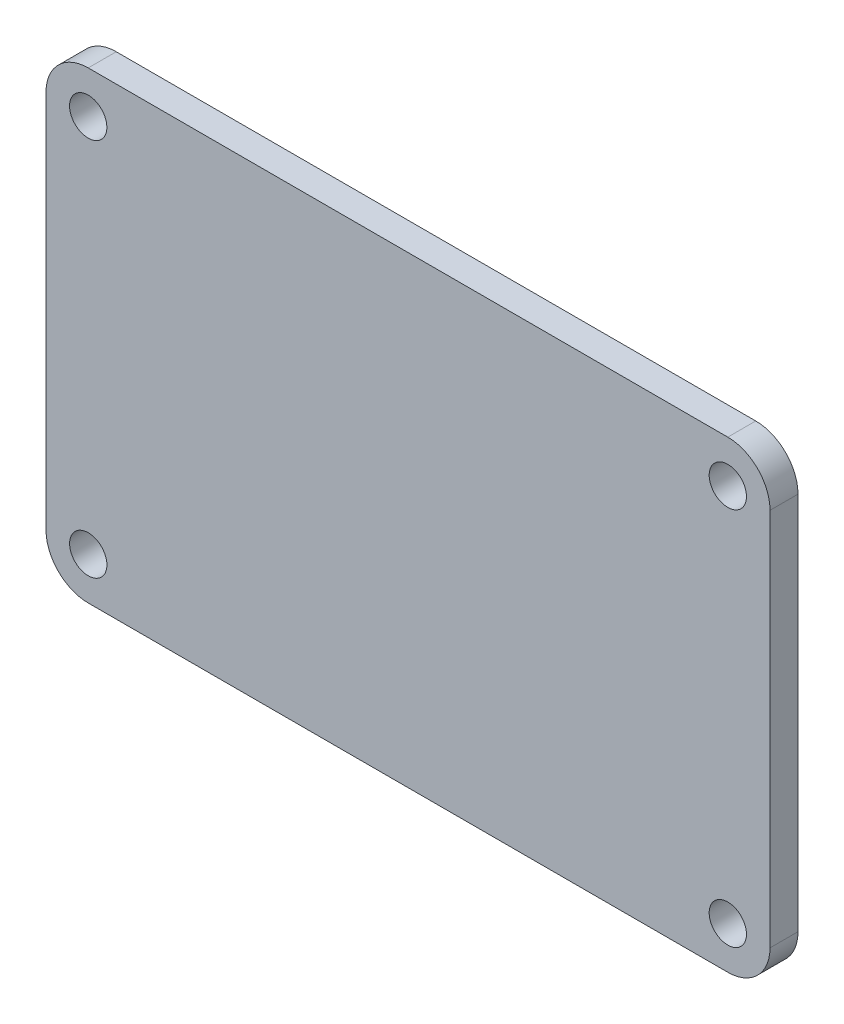
ISO-10303-21;
HEADER;
FILE_DESCRIPTION(('STEP AP214'),'2;1');
FILE_NAME('part.step','',(''),(''),'','','');
FILE_SCHEMA(('AUTOMOTIVE_DESIGN { 1 0 10303 214 1 1 1 1 }'));
ENDSEC;
DATA;
#1=APPLICATION_CONTEXT('core data for automotive mechanical design processes');
#2=APPLICATION_PROTOCOL_DEFINITION('international standard','automotive_design',2000,#1);
#3=PRODUCT_CONTEXT('',#1,'mechanical');
#4=PRODUCT('Part','Part','',(#3));
#5=PRODUCT_RELATED_PRODUCT_CATEGORY('part','',(#4));
#6=PRODUCT_DEFINITION_FORMATION('','',#4);
#7=PRODUCT_DEFINITION_CONTEXT('part definition',#1,'design');
#8=PRODUCT_DEFINITION('design','',#6,#7);
#9=PRODUCT_DEFINITION_SHAPE('','',#8);
#10=(LENGTH_UNIT() NAMED_UNIT(*) SI_UNIT(.MILLI.,.METRE.));
#11=(NAMED_UNIT(*) PLANE_ANGLE_UNIT() SI_UNIT($,.RADIAN.));
#12=(NAMED_UNIT(*) SI_UNIT($,.STERADIAN.) SOLID_ANGLE_UNIT());
#13=UNCERTAINTY_MEASURE_WITH_UNIT(LENGTH_MEASURE(1.E-05),#10,'distance_accuracy_value','');
#14=(GEOMETRIC_REPRESENTATION_CONTEXT(3) GLOBAL_UNCERTAINTY_ASSIGNED_CONTEXT((#13)) GLOBAL_UNIT_ASSIGNED_CONTEXT((#10,
#11,#12)) REPRESENTATION_CONTEXT('',''));
#15=CARTESIAN_POINT('',(0.,0.,0.));
#16=DIRECTION('',(0.,0.,1.));
#17=DIRECTION('',(1.,0.,0.));
#18=AXIS2_PLACEMENT_3D('',#15,#16,#17);
#19=CARTESIAN_POINT('',(-34.285,20.315,1.5));
#20=DIRECTION('',(0.,0.,-1.));
#21=DIRECTION('',(-1.,0.,0.));
#22=AXIS2_PLACEMENT_3D('',#19,#20,#21);
#23=PLANE('',#22);
#24=CARTESIAN_POINT('',(-34.285,20.315,1.5));
#25=DIRECTION('',(0.,0.,1.));
#26=DIRECTION('',(-1.,0.,0.));
#27=AXIS2_PLACEMENT_3D('',#24,#25,#26);
#28=CIRCLE('',#27,4.53);
#29=CARTESIAN_POINT('',(-34.285,24.845,1.5));
#30=VERTEX_POINT('',#29);
#31=CARTESIAN_POINT('',(-38.815,20.315,1.5));
#32=VERTEX_POINT('',#31);
#33=EDGE_CURVE('E148',#30,#32,#28,.T.);
#34=ORIENTED_EDGE('',*,*,#33,.T.);
#35=DIRECTION('',(0.,-1.,0.));
#36=VECTOR('',#35,1.);
#37=CARTESIAN_POINT('',(-38.815,20.315,1.5));
#38=LINE('',#37,#36);
#39=CARTESIAN_POINT('',(-38.815,-20.315,1.5));
#40=VERTEX_POINT('',#39);
#41=EDGE_CURVE('E96',#32,#40,#38,.T.);
#42=ORIENTED_EDGE('',*,*,#41,.T.);
#43=CARTESIAN_POINT('',(-34.285,-20.315,1.5));
#44=DIRECTION('',(0.,0.,1.));
#45=DIRECTION('',(1.,0.,0.));
#46=AXIS2_PLACEMENT_3D('',#43,#44,#45);
#47=CIRCLE('',#46,4.53);
#48=CARTESIAN_POINT('',(-34.285,-24.845,1.5));
#49=VERTEX_POINT('',#48);
#50=EDGE_CURVE('E163',#40,#49,#47,.T.);
#51=ORIENTED_EDGE('',*,*,#50,.T.);
#52=DIRECTION('',(1.,0.,0.));
#53=VECTOR('',#52,1.);
#54=CARTESIAN_POINT('',(-34.285,-24.845,1.5));
#55=LINE('',#54,#53);
#56=CARTESIAN_POINT('',(34.285,-24.845,1.5));
#57=VERTEX_POINT('',#56);
#58=EDGE_CURVE('E176',#49,#57,#55,.T.);
#59=ORIENTED_EDGE('',*,*,#58,.T.);
#60=CARTESIAN_POINT('',(34.285,-20.315,1.5));
#61=DIRECTION('',(0.,0.,1.));
#62=DIRECTION('',(1.,0.,0.));
#63=AXIS2_PLACEMENT_3D('',#60,#61,#62);
#64=CIRCLE('',#63,4.52999999999999);
#65=CARTESIAN_POINT('',(38.815,-20.315,1.5));
#66=VERTEX_POINT('',#65);
#67=EDGE_CURVE('E115',#57,#66,#64,.T.);
#68=ORIENTED_EDGE('',*,*,#67,.T.);
#69=DIRECTION('',(0.,1.,0.));
#70=VECTOR('',#69,1.);
#71=CARTESIAN_POINT('',(38.815,20.315,1.5));
#72=LINE('',#71,#70);
#73=CARTESIAN_POINT('',(38.815,20.315,1.5));
#74=VERTEX_POINT('',#73);
#75=EDGE_CURVE('E109',#66,#74,#72,.T.);
#76=ORIENTED_EDGE('',*,*,#75,.T.);
#77=CARTESIAN_POINT('',(34.285,20.315,1.5));
#78=DIRECTION('',(0.,0.,1.));
#79=DIRECTION('',(1.,0.,0.));
#80=AXIS2_PLACEMENT_3D('',#77,#78,#79);
#81=CIRCLE('',#80,4.53);
#82=CARTESIAN_POINT('',(34.285,24.845,1.5));
#83=VERTEX_POINT('',#82);
#84=EDGE_CURVE('E113',#74,#83,#81,.T.);
#85=ORIENTED_EDGE('',*,*,#84,.T.);
#86=DIRECTION('',(-1.,0.,0.));
#87=VECTOR('',#86,1.);
#88=CARTESIAN_POINT('',(-34.285,24.845,1.5));
#89=LINE('',#88,#87);
#90=EDGE_CURVE('E53',#83,#30,#89,.T.);
#91=ORIENTED_EDGE('',*,*,#90,.T.);
#92=EDGE_LOOP('',(#34,#42,#51,#59,#68,#76,#85,#91));
#93=FACE_BOUND('',#92,.T.);
#94=CARTESIAN_POINT('',(34.29,20.32,1.5));
#95=DIRECTION('',(0.,0.,1.));
#96=DIRECTION('',(1.,0.,0.));
#97=AXIS2_PLACEMENT_3D('',#94,#95,#96);
#98=CIRCLE('',#97,2.);
#99=CARTESIAN_POINT('',(36.29,20.32,1.5));
#100=VERTEX_POINT('',#99);
#101=EDGE_CURVE('E137',#100,#100,#98,.T.);
#102=ORIENTED_EDGE('',*,*,#101,.F.);
#103=EDGE_LOOP('',(#102));
#104=FACE_BOUND('',#103,.T.);
#105=CARTESIAN_POINT('',(34.29,-20.32,1.5));
#106=DIRECTION('',(0.,0.,1.));
#107=DIRECTION('',(1.,0.,0.));
#108=AXIS2_PLACEMENT_3D('',#105,#106,#107);
#109=CIRCLE('',#108,2.);
#110=CARTESIAN_POINT('',(36.29,-20.32,1.5));
#111=VERTEX_POINT('',#110);
#112=EDGE_CURVE('E185',#111,#111,#109,.T.);
#113=ORIENTED_EDGE('',*,*,#112,.F.);
#114=EDGE_LOOP('',(#113));
#115=FACE_BOUND('',#114,.T.);
#116=CARTESIAN_POINT('',(-34.29,20.32,1.5));
#117=DIRECTION('',(0.,0.,1.));
#118=DIRECTION('',(1.,0.,0.));
#119=AXIS2_PLACEMENT_3D('',#116,#117,#118);
#120=CIRCLE('',#119,2.);
#121=CARTESIAN_POINT('',(-32.29,20.32,1.5));
#122=VERTEX_POINT('',#121);
#123=EDGE_CURVE('E191',#122,#122,#120,.T.);
#124=ORIENTED_EDGE('',*,*,#123,.F.);
#125=EDGE_LOOP('',(#124));
#126=FACE_BOUND('',#125,.T.);
#127=CARTESIAN_POINT('',(-34.285,-20.315,1.5));
#128=DIRECTION('',(0.,0.,1.));
#129=DIRECTION('',(1.,0.,0.));
#130=AXIS2_PLACEMENT_3D('',#127,#128,#129);
#131=CIRCLE('',#130,2.);
#132=CARTESIAN_POINT('',(-32.285,-20.315,1.5));
#133=VERTEX_POINT('',#132);
#134=EDGE_CURVE('E197',#133,#133,#131,.T.);
#135=ORIENTED_EDGE('',*,*,#134,.F.);
#136=EDGE_LOOP('',(#135));
#137=FACE_BOUND('',#136,.T.);
#138=ADVANCED_FACE('F36',(#93,#104,#115,#126,#137),#23,.F.);
#139=CARTESIAN_POINT('',(-34.285,20.315,-1.5));
#140=DIRECTION('',(0.,0.,-1.));
#141=DIRECTION('',(-1.,0.,0.));
#142=AXIS2_PLACEMENT_3D('',#139,#140,#141);
#143=PLANE('',#142);
#144=CARTESIAN_POINT('',(-34.29,20.32,-1.5));
#145=DIRECTION('',(0.,0.,1.));
#146=DIRECTION('',(1.,0.,0.));
#147=AXIS2_PLACEMENT_3D('',#144,#145,#146);
#148=CIRCLE('',#147,2.);
#149=CARTESIAN_POINT('',(-32.29,20.32,-1.5));
#150=VERTEX_POINT('',#149);
#151=EDGE_CURVE('E194',#150,#150,#148,.T.);
#152=ORIENTED_EDGE('',*,*,#151,.T.);
#153=EDGE_LOOP('',(#152));
#154=FACE_BOUND('',#153,.T.);
#155=CARTESIAN_POINT('',(34.29,20.32,-1.5));
#156=DIRECTION('',(0.,0.,1.));
#157=DIRECTION('',(1.,0.,0.));
#158=AXIS2_PLACEMENT_3D('',#155,#156,#157);
#159=CIRCLE('',#158,2.);
#160=CARTESIAN_POINT('',(36.29,20.32,-1.5));
#161=VERTEX_POINT('',#160);
#162=EDGE_CURVE('E182',#161,#161,#159,.T.);
#163=ORIENTED_EDGE('',*,*,#162,.T.);
#164=EDGE_LOOP('',(#163));
#165=FACE_BOUND('',#164,.T.);
#166=CARTESIAN_POINT('',(-34.285,20.315,-1.5));
#167=DIRECTION('',(0.,0.,1.));
#168=DIRECTION('',(-1.,0.,0.));
#169=AXIS2_PLACEMENT_3D('',#166,#167,#168);
#170=CIRCLE('',#169,4.53);
#171=CARTESIAN_POINT('',(-34.285,24.845,-1.5));
#172=VERTEX_POINT('',#171);
#173=CARTESIAN_POINT('',(-38.815,20.315,-1.5));
#174=VERTEX_POINT('',#173);
#175=EDGE_CURVE('E133',#172,#174,#170,.T.);
#176=ORIENTED_EDGE('',*,*,#175,.F.);
#177=DIRECTION('',(-1.,0.,0.));
#178=VECTOR('',#177,1.);
#179=CARTESIAN_POINT('',(-34.285,24.845,-1.5));
#180=LINE('',#179,#178);
#181=CARTESIAN_POINT('',(34.285,24.845,-1.5));
#182=VERTEX_POINT('',#181);
#183=EDGE_CURVE('E88',#182,#172,#180,.T.);
#184=ORIENTED_EDGE('',*,*,#183,.F.);
#185=CARTESIAN_POINT('',(34.285,20.315,-1.5));
#186=DIRECTION('',(0.,0.,1.));
#187=DIRECTION('',(1.,0.,0.));
#188=AXIS2_PLACEMENT_3D('',#185,#186,#187);
#189=CIRCLE('',#188,4.53);
#190=CARTESIAN_POINT('',(38.815,20.315,-1.5));
#191=VERTEX_POINT('',#190);
#192=EDGE_CURVE('E82',#191,#182,#189,.T.);
#193=ORIENTED_EDGE('',*,*,#192,.F.);
#194=DIRECTION('',(0.,1.,0.));
#195=VECTOR('',#194,1.);
#196=CARTESIAN_POINT('',(38.815,20.315,-1.5));
#197=LINE('',#196,#195);
#198=CARTESIAN_POINT('',(38.815,-20.315,-1.5));
#199=VERTEX_POINT('',#198);
#200=EDGE_CURVE('E123',#199,#191,#197,.T.);
#201=ORIENTED_EDGE('',*,*,#200,.F.);
#202=CARTESIAN_POINT('',(34.285,-20.315,-1.5));
#203=DIRECTION('',(0.,0.,1.));
#204=DIRECTION('',(1.,0.,0.));
#205=AXIS2_PLACEMENT_3D('',#202,#203,#204);
#206=CIRCLE('',#205,4.52999999999999);
#207=CARTESIAN_POINT('',(34.285,-24.845,-1.5));
#208=VERTEX_POINT('',#207);
#209=EDGE_CURVE('E143',#208,#199,#206,.T.);
#210=ORIENTED_EDGE('',*,*,#209,.F.);
#211=DIRECTION('',(1.,0.,0.));
#212=VECTOR('',#211,1.);
#213=CARTESIAN_POINT('',(-34.285,-24.845,-1.5));
#214=LINE('',#213,#212);
#215=CARTESIAN_POINT('',(-34.285,-24.845,-1.5));
#216=VERTEX_POINT('',#215);
#217=EDGE_CURVE('E141',#216,#208,#214,.T.);
#218=ORIENTED_EDGE('',*,*,#217,.F.);
#219=CARTESIAN_POINT('',(-34.285,-20.315,-1.5));
#220=DIRECTION('',(0.,0.,1.));
#221=DIRECTION('',(1.,0.,0.));
#222=AXIS2_PLACEMENT_3D('',#219,#220,#221);
#223=CIRCLE('',#222,4.53);
#224=CARTESIAN_POINT('',(-38.815,-20.315,-1.5));
#225=VERTEX_POINT('',#224);
#226=EDGE_CURVE('E139',#225,#216,#223,.T.);
#227=ORIENTED_EDGE('',*,*,#226,.F.);
#228=DIRECTION('',(0.,-1.,0.));
#229=VECTOR('',#228,1.);
#230=CARTESIAN_POINT('',(-38.815,20.315,-1.5));
#231=LINE('',#230,#229);
#232=EDGE_CURVE('E136',#174,#225,#231,.T.);
#233=ORIENTED_EDGE('',*,*,#232,.F.);
#234=EDGE_LOOP('',(#176,#184,#193,#201,#210,#218,#227,#233));
#235=FACE_BOUND('',#234,.T.);
#236=CARTESIAN_POINT('',(34.29,-20.32,-1.5));
#237=DIRECTION('',(0.,0.,1.));
#238=DIRECTION('',(1.,0.,0.));
#239=AXIS2_PLACEMENT_3D('',#236,#237,#238);
#240=CIRCLE('',#239,2.);
#241=CARTESIAN_POINT('',(36.29,-20.32,-1.5));
#242=VERTEX_POINT('',#241);
#243=EDGE_CURVE('E188',#242,#242,#240,.T.);
#244=ORIENTED_EDGE('',*,*,#243,.T.);
#245=EDGE_LOOP('',(#244));
#246=FACE_BOUND('',#245,.T.);
#247=CARTESIAN_POINT('',(-34.285,-20.315,-1.5));
#248=DIRECTION('',(0.,0.,1.));
#249=DIRECTION('',(1.,0.,0.));
#250=AXIS2_PLACEMENT_3D('',#247,#248,#249);
#251=CIRCLE('',#250,2.);
#252=CARTESIAN_POINT('',(-32.285,-20.315,-1.5));
#253=VERTEX_POINT('',#252);
#254=EDGE_CURVE('E200',#253,#253,#251,.T.);
#255=ORIENTED_EDGE('',*,*,#254,.T.);
#256=EDGE_LOOP('',(#255));
#257=FACE_BOUND('',#256,.T.);
#258=ADVANCED_FACE('F167',(#154,#165,#235,#246,#257),#143,.T.);
#259=CARTESIAN_POINT('',(-34.285,20.315,1.5));
#260=DIRECTION('',(0.,0.,-1.));
#261=DIRECTION('',(-1.,0.,0.));
#262=AXIS2_PLACEMENT_3D('',#259,#260,#261);
#263=CYLINDRICAL_SURFACE('',#262,4.53);
#264=ORIENTED_EDGE('',*,*,#175,.T.);
#265=DIRECTION('',(0.,0.,-1.));
#266=VECTOR('',#265,1.);
#267=CARTESIAN_POINT('',(-38.815,20.315,1.5));
#268=LINE('',#267,#266);
#269=EDGE_CURVE('E11',#32,#174,#268,.T.);
#270=ORIENTED_EDGE('',*,*,#269,.F.);
#271=ORIENTED_EDGE('',*,*,#33,.F.);
#272=DIRECTION('',(0.,0.,-1.));
#273=VECTOR('',#272,1.);
#274=CARTESIAN_POINT('',(-34.285,24.845,1.5));
#275=LINE('',#274,#273);
#276=EDGE_CURVE('E129',#30,#172,#275,.T.);
#277=ORIENTED_EDGE('',*,*,#276,.T.);
#278=EDGE_LOOP('',(#264,#270,#271,#277));
#279=FACE_BOUND('',#278,.T.);
#280=ADVANCED_FACE('F38',(#279),#263,.T.);
#281=CARTESIAN_POINT('',(-38.815,20.315,1.5));
#282=DIRECTION('',(1.,0.,0.));
#283=DIRECTION('',(0.,1.,0.));
#284=AXIS2_PLACEMENT_3D('',#281,#282,#283);
#285=PLANE('',#284);
#286=ORIENTED_EDGE('',*,*,#232,.T.);
#287=DIRECTION('',(0.,0.,-1.));
#288=VECTOR('',#287,1.);
#289=CARTESIAN_POINT('',(-38.815,-20.315,1.5));
#290=LINE('',#289,#288);
#291=EDGE_CURVE('E45',#40,#225,#290,.T.);
#292=ORIENTED_EDGE('',*,*,#291,.F.);
#293=ORIENTED_EDGE('',*,*,#41,.F.);
#294=ORIENTED_EDGE('',*,*,#269,.T.);
#295=EDGE_LOOP('',(#286,#292,#293,#294));
#296=FACE_BOUND('',#295,.T.);
#297=ADVANCED_FACE('F232',(#296),#285,.F.);
#298=CARTESIAN_POINT('',(-34.285,-20.315,1.5));
#299=DIRECTION('',(0.,0.,-1.));
#300=DIRECTION('',(-1.,0.,0.));
#301=AXIS2_PLACEMENT_3D('',#298,#299,#300);
#302=CYLINDRICAL_SURFACE('',#301,4.53);
#303=ORIENTED_EDGE('',*,*,#226,.T.);
#304=DIRECTION('',(0.,0.,-1.));
#305=VECTOR('',#304,1.);
#306=CARTESIAN_POINT('',(-34.285,-24.845,1.5));
#307=LINE('',#306,#305);
#308=EDGE_CURVE('E155',#49,#216,#307,.T.);
#309=ORIENTED_EDGE('',*,*,#308,.F.);
#310=ORIENTED_EDGE('',*,*,#50,.F.);
#311=ORIENTED_EDGE('',*,*,#291,.T.);
#312=EDGE_LOOP('',(#303,#309,#310,#311));
#313=FACE_BOUND('',#312,.T.);
#314=ADVANCED_FACE('F161',(#313),#302,.T.);
#315=CARTESIAN_POINT('',(-34.285,-24.845,1.5));
#316=DIRECTION('',(0.,1.,0.));
#317=DIRECTION('',(0.,0.,1.));
#318=AXIS2_PLACEMENT_3D('',#315,#316,#317);
#319=PLANE('',#318);
#320=ORIENTED_EDGE('',*,*,#217,.T.);
#321=DIRECTION('',(0.,0.,-1.));
#322=VECTOR('',#321,1.);
#323=CARTESIAN_POINT('',(34.285,-24.845,1.5));
#324=LINE('',#323,#322);
#325=EDGE_CURVE('E152',#57,#208,#324,.T.);
#326=ORIENTED_EDGE('',*,*,#325,.F.);
#327=ORIENTED_EDGE('',*,*,#58,.F.);
#328=ORIENTED_EDGE('',*,*,#308,.T.);
#329=EDGE_LOOP('',(#320,#326,#327,#328));
#330=FACE_BOUND('',#329,.T.);
#331=ADVANCED_FACE('F172',(#330),#319,.F.);
#332=CARTESIAN_POINT('',(34.285,-20.315,1.5));
#333=DIRECTION('',(0.,0.,-1.));
#334=DIRECTION('',(-1.,0.,0.));
#335=AXIS2_PLACEMENT_3D('',#332,#333,#334);
#336=CYLINDRICAL_SURFACE('',#335,4.52999999999999);
#337=ORIENTED_EDGE('',*,*,#209,.T.);
#338=DIRECTION('',(0.,0.,-1.));
#339=VECTOR('',#338,1.);
#340=CARTESIAN_POINT('',(38.815,-20.315,1.5));
#341=LINE('',#340,#339);
#342=EDGE_CURVE('E124',#66,#199,#341,.T.);
#343=ORIENTED_EDGE('',*,*,#342,.F.);
#344=ORIENTED_EDGE('',*,*,#67,.F.);
#345=ORIENTED_EDGE('',*,*,#325,.T.);
#346=EDGE_LOOP('',(#337,#343,#344,#345));
#347=FACE_BOUND('',#346,.T.);
#348=ADVANCED_FACE('F175',(#347),#336,.T.);
#349=CARTESIAN_POINT('',(38.815,20.315,1.5));
#350=DIRECTION('',(-1.,0.,0.));
#351=DIRECTION('',(0.,0.,1.));
#352=AXIS2_PLACEMENT_3D('',#349,#350,#351);
#353=PLANE('',#352);
#354=ORIENTED_EDGE('',*,*,#200,.T.);
#355=DIRECTION('',(0.,0.,-1.));
#356=VECTOR('',#355,1.);
#357=CARTESIAN_POINT('',(38.815,20.315,1.5));
#358=LINE('',#357,#356);
#359=EDGE_CURVE('E120',#74,#191,#358,.T.);
#360=ORIENTED_EDGE('',*,*,#359,.F.);
#361=ORIENTED_EDGE('',*,*,#75,.F.);
#362=ORIENTED_EDGE('',*,*,#342,.T.);
#363=EDGE_LOOP('',(#354,#360,#361,#362));
#364=FACE_BOUND('',#363,.T.);
#365=ADVANCED_FACE('F121',(#364),#353,.F.);
#366=CARTESIAN_POINT('',(34.285,20.315,1.5));
#367=DIRECTION('',(0.,0.,-1.));
#368=DIRECTION('',(-1.,0.,0.));
#369=AXIS2_PLACEMENT_3D('',#366,#367,#368);
#370=CYLINDRICAL_SURFACE('',#369,4.53);
#371=ORIENTED_EDGE('',*,*,#192,.T.);
#372=DIRECTION('',(0.,0.,-1.));
#373=VECTOR('',#372,1.);
#374=CARTESIAN_POINT('',(34.285,24.845,1.5));
#375=LINE('',#374,#373);
#376=EDGE_CURVE('E125',#83,#182,#375,.T.);
#377=ORIENTED_EDGE('',*,*,#376,.F.);
#378=ORIENTED_EDGE('',*,*,#84,.F.);
#379=ORIENTED_EDGE('',*,*,#359,.T.);
#380=EDGE_LOOP('',(#371,#377,#378,#379));
#381=FACE_BOUND('',#380,.T.);
#382=ADVANCED_FACE('F127',(#381),#370,.T.);
#383=CARTESIAN_POINT('',(-34.285,24.845,1.5));
#384=DIRECTION('',(0.,-1.,0.));
#385=DIRECTION('',(0.,0.,-1.));
#386=AXIS2_PLACEMENT_3D('',#383,#384,#385);
#387=PLANE('',#386);
#388=ORIENTED_EDGE('',*,*,#183,.T.);
#389=ORIENTED_EDGE('',*,*,#276,.F.);
#390=ORIENTED_EDGE('',*,*,#90,.F.);
#391=ORIENTED_EDGE('',*,*,#376,.T.);
#392=EDGE_LOOP('',(#388,#389,#390,#391));
#393=FACE_BOUND('',#392,.T.);
#394=ADVANCED_FACE('F220',(#393),#387,.F.);
#395=CARTESIAN_POINT('',(34.29,20.32,1.5));
#396=DIRECTION('',(0.,0.,-1.));
#397=DIRECTION('',(-1.,0.,0.));
#398=AXIS2_PLACEMENT_3D('',#395,#396,#397);
#399=CYLINDRICAL_SURFACE('',#398,2.);
#400=ORIENTED_EDGE('',*,*,#101,.T.);
#401=EDGE_LOOP('',(#400));
#402=FACE_BOUND('',#401,.T.);
#403=ORIENTED_EDGE('',*,*,#162,.F.);
#404=EDGE_LOOP('',(#403));
#405=FACE_BOUND('',#404,.T.);
#406=ADVANCED_FACE('F217',(#402,#405),#399,.F.);
#407=CARTESIAN_POINT('',(34.29,-20.32,1.5));
#408=DIRECTION('',(0.,0.,-1.));
#409=DIRECTION('',(-1.,0.,0.));
#410=AXIS2_PLACEMENT_3D('',#407,#408,#409);
#411=CYLINDRICAL_SURFACE('',#410,2.);
#412=ORIENTED_EDGE('',*,*,#112,.T.);
#413=EDGE_LOOP('',(#412));
#414=FACE_BOUND('',#413,.T.);
#415=ORIENTED_EDGE('',*,*,#243,.F.);
#416=EDGE_LOOP('',(#415));
#417=FACE_BOUND('',#416,.T.);
#418=ADVANCED_FACE('F296',(#414,#417),#411,.F.);
#419=CARTESIAN_POINT('',(-34.29,20.32,1.5));
#420=DIRECTION('',(0.,0.,-1.));
#421=DIRECTION('',(-1.,0.,0.));
#422=AXIS2_PLACEMENT_3D('',#419,#420,#421);
#423=CYLINDRICAL_SURFACE('',#422,2.);
#424=ORIENTED_EDGE('',*,*,#123,.T.);
#425=EDGE_LOOP('',(#424));
#426=FACE_BOUND('',#425,.T.);
#427=ORIENTED_EDGE('',*,*,#151,.F.);
#428=EDGE_LOOP('',(#427));
#429=FACE_BOUND('',#428,.T.);
#430=ADVANCED_FACE('F304',(#426,#429),#423,.F.);
#431=CARTESIAN_POINT('',(-34.285,-20.315,1.5));
#432=DIRECTION('',(0.,0.,-1.));
#433=DIRECTION('',(-1.,0.,0.));
#434=AXIS2_PLACEMENT_3D('',#431,#432,#433);
#435=CYLINDRICAL_SURFACE('',#434,2.);
#436=ORIENTED_EDGE('',*,*,#134,.T.);
#437=EDGE_LOOP('',(#436));
#438=FACE_BOUND('',#437,.T.);
#439=ORIENTED_EDGE('',*,*,#254,.F.);
#440=EDGE_LOOP('',(#439));
#441=FACE_BOUND('',#440,.T.);
#442=ADVANCED_FACE('F206',(#438,#441),#435,.F.);
#443=CLOSED_SHELL('',(#138,#258,#280,#297,#314,#331,#348,#365,#382,#394,#406,#418,#430,#442));
#444=MANIFOLD_SOLID_BREP('B2',#443);
#445=ADVANCED_BREP_SHAPE_REPRESENTATION('',(#18,#444),#14);
#446=SHAPE_DEFINITION_REPRESENTATION(#9,#445);
ENDSEC;
END-ISO-10303-21;
